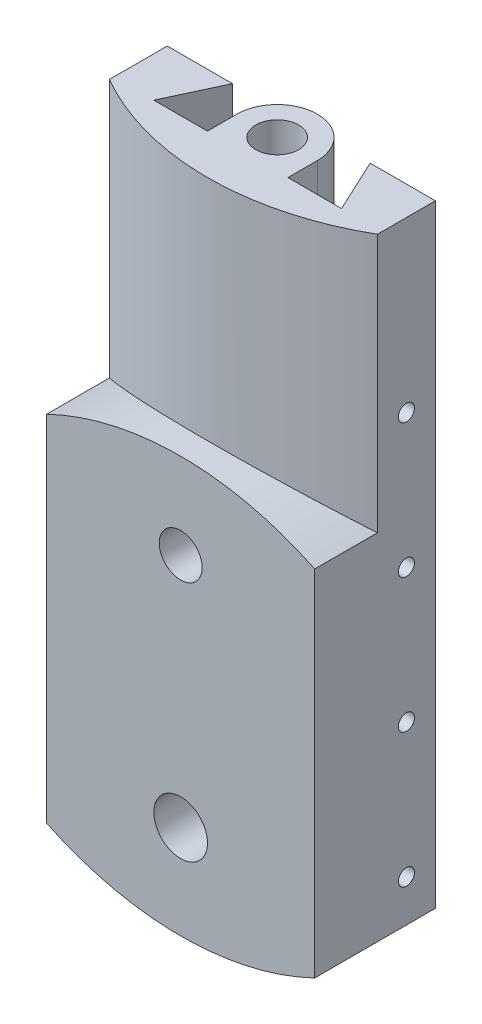
ISO-10303-21;
HEADER;
FILE_DESCRIPTION(('STEP AP214'),'2;1');
FILE_NAME('part.step','',(''),(''),'','','');
FILE_SCHEMA(('AUTOMOTIVE_DESIGN { 1 0 10303 214 1 1 1 1 }'));
ENDSEC;
DATA;
#1=APPLICATION_CONTEXT('core data for automotive mechanical design processes');
#2=APPLICATION_PROTOCOL_DEFINITION('international standard','automotive_design',2000,#1);
#3=PRODUCT_CONTEXT('',#1,'mechanical');
#4=PRODUCT('Part','Part','',(#3));
#5=PRODUCT_RELATED_PRODUCT_CATEGORY('part','',(#4));
#6=PRODUCT_DEFINITION_FORMATION('','',#4);
#7=PRODUCT_DEFINITION_CONTEXT('part definition',#1,'design');
#8=PRODUCT_DEFINITION('design','',#6,#7);
#9=PRODUCT_DEFINITION_SHAPE('','',#8);
#10=(LENGTH_UNIT() NAMED_UNIT(*) SI_UNIT(.MILLI.,.METRE.));
#11=(NAMED_UNIT(*) PLANE_ANGLE_UNIT() SI_UNIT($,.RADIAN.));
#12=(NAMED_UNIT(*) SI_UNIT($,.STERADIAN.) SOLID_ANGLE_UNIT());
#13=UNCERTAINTY_MEASURE_WITH_UNIT(LENGTH_MEASURE(1.E-05),#10,'distance_accuracy_value','');
#14=(GEOMETRIC_REPRESENTATION_CONTEXT(3) GLOBAL_UNCERTAINTY_ASSIGNED_CONTEXT((#13)) GLOBAL_UNIT_ASSIGNED_CONTEXT((#10,
#11,#12)) REPRESENTATION_CONTEXT('',''));
#15=CARTESIAN_POINT('',(0.,0.,0.));
#16=DIRECTION('',(0.,0.,1.));
#17=DIRECTION('',(1.,0.,0.));
#18=AXIS2_PLACEMENT_3D('',#15,#16,#17);
#19=CARTESIAN_POINT('',(0.,-240.,-23.5));
#20=DIRECTION('',(0.,0.,1.));
#21=DIRECTION('',(1.,0.,0.));
#22=AXIS2_PLACEMENT_3D('',#19,#20,#21);
#23=PLANE('',#22);
#24=CARTESIAN_POINT('',(0.,-117.,-23.5));
#25=DIRECTION('',(0.,0.,1.));
#26=DIRECTION('',(1.,0.,0.));
#27=AXIS2_PLACEMENT_3D('',#24,#25,#26);
#28=CIRCLE('',#27,8.);
#29=CARTESIAN_POINT('',(8.,-117.,-23.5));
#30=VERTEX_POINT('',#29);
#31=EDGE_CURVE('E416',#30,#30,#28,.T.);
#32=ORIENTED_EDGE('',*,*,#31,.T.);
#33=EDGE_LOOP('',(#32));
#34=FACE_BOUND('',#33,.T.);
#35=CARTESIAN_POINT('',(0.,-205.,-23.5));
#36=DIRECTION('',(0.,0.,1.));
#37=DIRECTION('',(1.,0.,0.));
#38=AXIS2_PLACEMENT_3D('',#35,#36,#37);
#39=CIRCLE('',#38,10.);
#40=CARTESIAN_POINT('',(10.,-205.,-23.5));
#41=VERTEX_POINT('',#40);
#42=EDGE_CURVE('E204',#41,#41,#39,.T.);
#43=ORIENTED_EDGE('',*,*,#42,.T.);
#44=EDGE_LOOP('',(#43));
#45=FACE_BOUND('',#44,.T.);
#46=CARTESIAN_POINT('',(0.,-125.,-23.5));
#47=DIRECTION('',(0.,0.,1.));
#48=DIRECTION('',(1.,0.,0.));
#49=AXIS2_PLACEMENT_3D('',#46,#47,#48);
#50=CIRCLE('',#49,115.);
#51=CARTESIAN_POINT('',(-15.,-239.017542509914,-23.5));
#52=VERTEX_POINT('',#51);
#53=CARTESIAN_POINT('',(15.,-239.017542509914,-23.5));
#54=VERTEX_POINT('',#53);
#55=EDGE_CURVE('E292',#52,#54,#50,.T.);
#56=ORIENTED_EDGE('',*,*,#55,.F.);
#57=DIRECTION('',(0.,1.,0.));
#58=VECTOR('',#57,1.);
#59=CARTESIAN_POINT('',(-15.,-240.,-23.5));
#60=LINE('',#59,#58);
#61=CARTESIAN_POINT('',(-15.,-25.,-23.5));
#62=VERTEX_POINT('',#61);
#63=EDGE_CURVE('E133',#52,#62,#60,.T.);
#64=ORIENTED_EDGE('',*,*,#63,.T.);
#65=DIRECTION('',(1.,0.,0.));
#66=VECTOR('',#65,1.);
#67=CARTESIAN_POINT('',(0.,-25.,-23.5));
#68=LINE('',#67,#66);
#69=CARTESIAN_POINT('',(15.,-25.,-23.5));
#70=VERTEX_POINT('',#69);
#71=EDGE_CURVE('E118',#62,#70,#68,.T.);
#72=ORIENTED_EDGE('',*,*,#71,.T.);
#73=DIRECTION('',(0.,1.,0.));
#74=VECTOR('',#73,1.);
#75=CARTESIAN_POINT('',(15.,-240.,-23.5));
#76=LINE('',#75,#74);
#77=EDGE_CURVE('E132',#54,#70,#76,.T.);
#78=ORIENTED_EDGE('',*,*,#77,.F.);
#79=EDGE_LOOP('',(#56,#64,#72,#78));
#80=FACE_BOUND('',#79,.T.);
#81=ADVANCED_FACE('F53',(#34,#45,#80),#23,.F.);
#82=CARTESIAN_POINT('',(-15.,-240.,0.));
#83=DIRECTION('',(-1.,0.,0.));
#84=DIRECTION('',(0.,0.,1.));
#85=AXIS2_PLACEMENT_3D('',#82,#83,#84);
#86=PLANE('',#85);
#87=DIRECTION('',(0.,0.,1.));
#88=VECTOR('',#87,1.);
#89=CARTESIAN_POINT('',(-15.,-239.017542509914,-51.));
#90=LINE('',#89,#88);
#91=CARTESIAN_POINT('',(-15.,-239.017542509914,-25.));
#92=VERTEX_POINT('',#91);
#93=EDGE_CURVE('E295',#92,#52,#90,.T.);
#94=ORIENTED_EDGE('',*,*,#93,.F.);
#95=DIRECTION('',(0.,1.,0.));
#96=VECTOR('',#95,1.);
#97=CARTESIAN_POINT('',(-15.,-240.,-25.));
#98=LINE('',#97,#96);
#99=CARTESIAN_POINT('',(-15.,-25.,-25.));
#100=VERTEX_POINT('',#99);
#101=EDGE_CURVE('E137',#92,#100,#98,.T.);
#102=ORIENTED_EDGE('',*,*,#101,.T.);
#103=DIRECTION('',(0.,0.,1.));
#104=VECTOR('',#103,1.);
#105=CARTESIAN_POINT('',(-15.,-25.,0.));
#106=LINE('',#105,#104);
#107=EDGE_CURVE('E117',#100,#62,#106,.T.);
#108=ORIENTED_EDGE('',*,*,#107,.T.);
#109=ORIENTED_EDGE('',*,*,#63,.F.);
#110=EDGE_LOOP('',(#94,#102,#108,#109));
#111=FACE_BOUND('',#110,.T.);
#112=ADVANCED_FACE('F228',(#111),#86,.F.);
#113=CARTESIAN_POINT('',(-50.,-240.,0.));
#114=DIRECTION('',(-1.,0.,0.));
#115=DIRECTION('',(0.,0.,1.));
#116=AXIS2_PLACEMENT_3D('',#113,#114,#115);
#117=PLANE('',#116);
#118=CARTESIAN_POINT('',(-50.,-63.,-34.1987298107781));
#119=DIRECTION('',(1.,0.,0.));
#120=DIRECTION('',(0.,0.,-1.));
#121=AXIS2_PLACEMENT_3D('',#118,#119,#120);
#122=CIRCLE('',#121,3.);
#123=CARTESIAN_POINT('',(-50.,-63.,-37.1987298107781));
#124=VERTEX_POINT('',#123);
#125=EDGE_CURVE('E472',#124,#124,#122,.T.);
#126=ORIENTED_EDGE('',*,*,#125,.T.);
#127=EDGE_LOOP('',(#126));
#128=FACE_BOUND('',#127,.T.);
#129=CARTESIAN_POINT('',(-50.,-113.,-34.1987298107781));
#130=DIRECTION('',(1.,0.,0.));
#131=DIRECTION('',(0.,0.,-1.));
#132=AXIS2_PLACEMENT_3D('',#129,#130,#131);
#133=CIRCLE('',#132,3.);
#134=CARTESIAN_POINT('',(-50.,-113.,-37.1987298107781));
#135=VERTEX_POINT('',#134);
#136=EDGE_CURVE('E481',#135,#135,#133,.T.);
#137=ORIENTED_EDGE('',*,*,#136,.T.);
#138=EDGE_LOOP('',(#137));
#139=FACE_BOUND('',#138,.T.);
#140=CARTESIAN_POINT('',(-50.,-163.,-34.1987298107781));
#141=DIRECTION('',(1.,0.,0.));
#142=DIRECTION('',(0.,0.,-1.));
#143=AXIS2_PLACEMENT_3D('',#140,#141,#142);
#144=CIRCLE('',#143,3.);
#145=CARTESIAN_POINT('',(-50.,-163.,-37.1987298107781));
#146=VERTEX_POINT('',#145);
#147=EDGE_CURVE('E489',#146,#146,#144,.T.);
#148=ORIENTED_EDGE('',*,*,#147,.T.);
#149=EDGE_LOOP('',(#148));
#150=FACE_BOUND('',#149,.T.);
#151=CARTESIAN_POINT('',(-50.,-213.,-34.1987298107781));
#152=DIRECTION('',(1.,0.,0.));
#153=DIRECTION('',(0.,0.,-1.));
#154=AXIS2_PLACEMENT_3D('',#151,#152,#153);
#155=CIRCLE('',#154,3.);
#156=CARTESIAN_POINT('',(-50.,-213.,-37.1987298107781));
#157=VERTEX_POINT('',#156);
#158=EDGE_CURVE('E495',#157,#157,#155,.T.);
#159=ORIENTED_EDGE('',*,*,#158,.T.);
#160=EDGE_LOOP('',(#159));
#161=FACE_BOUND('',#160,.T.);
#162=DIRECTION('',(0.,1.,0.));
#163=VECTOR('',#162,1.);
#164=CARTESIAN_POINT('',(-50.,-240.,-45.));
#165=LINE('',#164,#163);
#166=CARTESIAN_POINT('',(-50.,-228.56157588604,-45.));
#167=VERTEX_POINT('',#166);
#168=CARTESIAN_POINT('',(-50.,0.,-45.));
#169=VERTEX_POINT('',#168);
#170=EDGE_CURVE('E146',#167,#169,#165,.T.);
#171=ORIENTED_EDGE('',*,*,#170,.F.);
#172=DIRECTION('',(0.,0.,1.));
#173=VECTOR('',#172,1.);
#174=CARTESIAN_POINT('',(-50.,-228.56157588604,-51.002));
#175=LINE('',#174,#173);
#176=CARTESIAN_POINT('',(-50.,-228.56157588604,0.));
#177=VERTEX_POINT('',#176);
#178=EDGE_CURVE('E205',#167,#177,#175,.T.);
#179=ORIENTED_EDGE('',*,*,#178,.T.);
#180=DIRECTION('',(0.,-1.,0.));
#181=VECTOR('',#180,1.);
#182=CARTESIAN_POINT('',(-50.,-96.4384241139601,0.));
#183=LINE('',#182,#181);
#184=CARTESIAN_POINT('',(-50.,-96.4384241139601,0.));
#185=VERTEX_POINT('',#184);
#186=EDGE_CURVE('E378',#185,#177,#183,.T.);
#187=ORIENTED_EDGE('',*,*,#186,.F.);
#188=DIRECTION('',(0.,0.,1.));
#189=VECTOR('',#188,1.);
#190=CARTESIAN_POINT('',(-50.,-96.4384241139601,-51.002));
#191=LINE('',#190,#189);
#192=CARTESIAN_POINT('',(-50.,-96.4384241139601,-23.3974596215561));
#193=VERTEX_POINT('',#192);
#194=EDGE_CURVE('E68',#193,#185,#191,.T.);
#195=ORIENTED_EDGE('',*,*,#194,.F.);
#196=DIRECTION('',(0.,1.,0.));
#197=VECTOR('',#196,1.);
#198=CARTESIAN_POINT('',(-50.,-240.,-23.3974596215561));
#199=LINE('',#198,#197);
#200=CARTESIAN_POINT('',(-50.,0.,-23.3974596215561));
#201=VERTEX_POINT('',#200);
#202=EDGE_CURVE('E149',#193,#201,#199,.T.);
#203=ORIENTED_EDGE('',*,*,#202,.T.);
#204=DIRECTION('',(0.,0.,1.));
#205=VECTOR('',#204,1.);
#206=CARTESIAN_POINT('',(-50.,0.,0.));
#207=LINE('',#206,#205);
#208=EDGE_CURVE('E182',#169,#201,#207,.T.);
#209=ORIENTED_EDGE('',*,*,#208,.F.);
#210=EDGE_LOOP('',(#171,#179,#187,#195,#203,#209));
#211=FACE_BOUND('',#210,.T.);
#212=ADVANCED_FACE('F234',(#128,#139,#150,#161,#211),#117,.T.);
#213=CARTESIAN_POINT('',(0.,-240.,-45.));
#214=DIRECTION('',(0.,0.,-1.));
#215=DIRECTION('',(-1.,0.,0.));
#216=AXIS2_PLACEMENT_3D('',#213,#214,#215);
#217=PLANE('',#216);
#218=DIRECTION('',(0.,1.,0.));
#219=VECTOR('',#218,1.);
#220=CARTESIAN_POINT('',(-25.6738468368999,-240.,-45.));
#221=LINE('',#220,#219);
#222=CARTESIAN_POINT('',(-25.6738468368999,-237.097518208903,-45.));
#223=VERTEX_POINT('',#222);
#224=CARTESIAN_POINT('',(-25.6738468368999,0.,-45.));
#225=VERTEX_POINT('',#224);
#226=EDGE_CURVE('E143',#223,#225,#221,.T.);
#227=ORIENTED_EDGE('',*,*,#226,.F.);
#228=CARTESIAN_POINT('',(0.,-125.,-45.));
#229=DIRECTION('',(0.,0.,-1.));
#230=DIRECTION('',(-1.,0.,0.));
#231=AXIS2_PLACEMENT_3D('',#228,#229,#230);
#232=CIRCLE('',#231,115.);
#233=EDGE_CURVE('E301',#223,#167,#232,.T.);
#234=ORIENTED_EDGE('',*,*,#233,.T.);
#235=ORIENTED_EDGE('',*,*,#170,.T.);
#236=DIRECTION('',(-1.,0.,0.));
#237=VECTOR('',#236,1.);
#238=CARTESIAN_POINT('',(0.,0.,-45.));
#239=LINE('',#238,#237);
#240=EDGE_CURVE('E185',#225,#169,#239,.T.);
#241=ORIENTED_EDGE('',*,*,#240,.F.);
#242=EDGE_LOOP('',(#227,#234,#235,#241));
#243=FACE_BOUND('',#242,.T.);
#244=ADVANCED_FACE('F401',(#243),#217,.T.);
#245=CARTESIAN_POINT('',(-38.3243387085016,-240.,-17.8709326335006));
#246=DIRECTION('',(0.906307787036648,0.,0.422618261740704));
#247=DIRECTION('',(0.422618261740704,0.,-0.906307787036648));
#248=AXIS2_PLACEMENT_3D('',#245,#246,#247);
#249=PLANE('',#248);
#250=CARTESIAN_POINT('',(-30.7105618439354,-63.,-34.1987298107781));
#251=DIRECTION('',(0.906307787036648,0.,0.422618261740704));
#252=DIRECTION('',(0.422618261740704,0.,-0.906307787036648));
#253=AXIS2_PLACEMENT_3D('',#250,#251,#252);
#254=ELLIPSE('',#253,3.31013375688749,3.);
#255=CARTESIAN_POINT('',(-29.3116388694704,-63.,-37.1987298107781));
#256=VERTEX_POINT('',#255);
#257=EDGE_CURVE('E469',#256,#256,#254,.T.);
#258=ORIENTED_EDGE('',*,*,#257,.F.);
#259=EDGE_LOOP('',(#258));
#260=FACE_BOUND('',#259,.T.);
#261=CARTESIAN_POINT('',(-30.7105618439354,-113.,-34.1987298107781));
#262=DIRECTION('',(0.906307787036648,0.,0.422618261740704));
#263=DIRECTION('',(0.422618261740704,0.,-0.906307787036648));
#264=AXIS2_PLACEMENT_3D('',#261,#262,#263);
#265=ELLIPSE('',#264,3.31013375688749,3.);
#266=CARTESIAN_POINT('',(-29.3116388694704,-113.,-37.1987298107781));
#267=VERTEX_POINT('',#266);
#268=EDGE_CURVE('E512',#267,#267,#265,.T.);
#269=ORIENTED_EDGE('',*,*,#268,.F.);
#270=EDGE_LOOP('',(#269));
#271=FACE_BOUND('',#270,.T.);
#272=CARTESIAN_POINT('',(-30.7105618439354,-163.,-34.1987298107781));
#273=DIRECTION('',(0.906307787036648,0.,0.422618261740704));
#274=DIRECTION('',(0.422618261740704,0.,-0.906307787036648));
#275=AXIS2_PLACEMENT_3D('',#272,#273,#274);
#276=ELLIPSE('',#275,3.31013375688749,3.);
#277=CARTESIAN_POINT('',(-29.3116388694704,-163.,-37.1987298107781));
#278=VERTEX_POINT('',#277);
#279=EDGE_CURVE('E506',#278,#278,#276,.T.);
#280=ORIENTED_EDGE('',*,*,#279,.F.);
#281=EDGE_LOOP('',(#280));
#282=FACE_BOUND('',#281,.T.);
#283=CARTESIAN_POINT('',(-30.7105618439354,-213.,-34.1987298107781));
#284=DIRECTION('',(0.906307787036648,0.,0.422618261740704));
#285=DIRECTION('',(0.422618261740704,0.,-0.906307787036648));
#286=AXIS2_PLACEMENT_3D('',#283,#284,#285);
#287=ELLIPSE('',#286,3.31013375688749,3.);
#288=CARTESIAN_POINT('',(-29.3116388694704,-213.,-37.1987298107781));
#289=VERTEX_POINT('',#288);
#290=EDGE_CURVE('E478',#289,#289,#287,.T.);
#291=ORIENTED_EDGE('',*,*,#290,.F.);
#292=EDGE_LOOP('',(#291));
#293=FACE_BOUND('',#292,.T.);
#294=DIRECTION('',(0.,1.,0.));
#295=VECTOR('',#294,1.);
#296=CARTESIAN_POINT('',(-35.,-240.,-25.));
#297=LINE('',#296,#295);
#298=CARTESIAN_POINT('',(-35.,-234.544511501033,-25.));
#299=VERTEX_POINT('',#298);
#300=CARTESIAN_POINT('',(-35.,0.,-25.));
#301=VERTEX_POINT('',#300);
#302=EDGE_CURVE('E140',#299,#301,#297,.T.);
#303=ORIENTED_EDGE('',*,*,#302,.F.);
#304=CARTESIAN_POINT('',(0.,-125.,-100.057742217834));
#305=DIRECTION('',(0.906307787036648,0.,0.422618261740704));
#306=DIRECTION('',(-0.422618261740704,0.,0.906307787036648));
#307=AXIS2_PLACEMENT_3D('',#304,#305,#306);
#308=ELLIPSE('',#307,272.113182062535,115.);
#309=EDGE_CURVE('E408',#299,#223,#308,.T.);
#310=ORIENTED_EDGE('',*,*,#309,.T.);
#311=ORIENTED_EDGE('',*,*,#226,.T.);
#312=DIRECTION('',(0.422618261740704,0.,-0.906307787036648));
#313=VECTOR('',#312,1.);
#314=CARTESIAN_POINT('',(-38.3243387085016,0.,-17.8709326335006));
#315=LINE('',#314,#313);
#316=EDGE_CURVE('E188',#301,#225,#315,.T.);
#317=ORIENTED_EDGE('',*,*,#316,.F.);
#318=EDGE_LOOP('',(#303,#310,#311,#317));
#319=FACE_BOUND('',#318,.T.);
#320=ADVANCED_FACE('F544',(#260,#271,#282,#293,#319),#249,.T.);
#321=CARTESIAN_POINT('',(0.,-240.,-25.));
#322=DIRECTION('',(0.,0.,-1.));
#323=DIRECTION('',(-1.,0.,0.));
#324=AXIS2_PLACEMENT_3D('',#321,#322,#323);
#325=PLANE('',#324);
#326=ORIENTED_EDGE('',*,*,#101,.F.);
#327=CARTESIAN_POINT('',(0.,-125.,-25.));
#328=DIRECTION('',(0.,0.,-1.));
#329=DIRECTION('',(-1.,0.,0.));
#330=AXIS2_PLACEMENT_3D('',#327,#328,#329);
#331=CIRCLE('',#330,115.);
#332=EDGE_CURVE('E306',#92,#299,#331,.T.);
#333=ORIENTED_EDGE('',*,*,#332,.T.);
#334=ORIENTED_EDGE('',*,*,#302,.T.);
#335=DIRECTION('',(-1.,0.,0.));
#336=VECTOR('',#335,1.);
#337=CARTESIAN_POINT('',(0.,0.,-25.));
#338=LINE('',#337,#336);
#339=CARTESIAN_POINT('',(-15.,0.,-25.));
#340=VERTEX_POINT('',#339);
#341=EDGE_CURVE('E191',#340,#301,#338,.T.);
#342=ORIENTED_EDGE('',*,*,#341,.F.);
#343=EDGE_CURVE('E100',#100,#340,#98,.T.);
#344=ORIENTED_EDGE('',*,*,#343,.F.);
#345=EDGE_LOOP('',(#326,#333,#334,#342,#344));
#346=FACE_BOUND('',#345,.T.);
#347=ADVANCED_FACE('F305',(#346),#325,.T.);
#348=CARTESIAN_POINT('',(15.,-240.,0.));
#349=DIRECTION('',(1.,0.,0.));
#350=DIRECTION('',(0.,0.,-1.));
#351=AXIS2_PLACEMENT_3D('',#348,#349,#350);
#352=PLANE('',#351);
#353=DIRECTION('',(0.,0.,1.));
#354=VECTOR('',#353,1.);
#355=CARTESIAN_POINT('',(15.,-239.017542509914,-51.));
#356=LINE('',#355,#354);
#357=CARTESIAN_POINT('',(15.,-239.017542509914,-25.));
#358=VERTEX_POINT('',#357);
#359=EDGE_CURVE('E286',#54,#358,#356,.F.);
#360=ORIENTED_EDGE('',*,*,#359,.F.);
#361=ORIENTED_EDGE('',*,*,#77,.T.);
#362=DIRECTION('',(0.,0.,-1.));
#363=VECTOR('',#362,1.);
#364=CARTESIAN_POINT('',(15.,-25.,0.));
#365=LINE('',#364,#363);
#366=CARTESIAN_POINT('',(15.,-25.,-25.));
#367=VERTEX_POINT('',#366);
#368=EDGE_CURVE('E124',#70,#367,#365,.T.);
#369=ORIENTED_EDGE('',*,*,#368,.T.);
#370=DIRECTION('',(0.,1.,0.));
#371=VECTOR('',#370,1.);
#372=CARTESIAN_POINT('',(15.,-240.,-25.));
#373=LINE('',#372,#371);
#374=EDGE_CURVE('E164',#358,#367,#373,.T.);
#375=ORIENTED_EDGE('',*,*,#374,.F.);
#376=EDGE_LOOP('',(#360,#361,#369,#375));
#377=FACE_BOUND('',#376,.T.);
#378=ADVANCED_FACE('F282',(#377),#352,.F.);
#379=CARTESIAN_POINT('',(0.,-240.,-25.));
#380=DIRECTION('',(0.,0.,-1.));
#381=DIRECTION('',(-1.,0.,0.));
#382=AXIS2_PLACEMENT_3D('',#379,#380,#381);
#383=PLANE('',#382);
#384=DIRECTION('',(0.,1.,0.));
#385=VECTOR('',#384,1.);
#386=CARTESIAN_POINT('',(35.,-240.,-25.));
#387=LINE('',#386,#385);
#388=CARTESIAN_POINT('',(35.,-234.544511501033,-25.));
#389=VERTEX_POINT('',#388);
#390=CARTESIAN_POINT('',(35.,0.,-25.));
#391=VERTEX_POINT('',#390);
#392=EDGE_CURVE('E160',#389,#391,#387,.T.);
#393=ORIENTED_EDGE('',*,*,#392,.F.);
#394=CARTESIAN_POINT('',(0.,-125.,-25.));
#395=DIRECTION('',(0.,0.,-1.));
#396=DIRECTION('',(-1.,0.,0.));
#397=AXIS2_PLACEMENT_3D('',#394,#395,#396);
#398=CIRCLE('',#397,115.);
#399=EDGE_CURVE('E422',#389,#358,#398,.T.);
#400=ORIENTED_EDGE('',*,*,#399,.T.);
#401=ORIENTED_EDGE('',*,*,#374,.T.);
#402=CARTESIAN_POINT('',(15.,0.,-25.));
#403=VERTEX_POINT('',#402);
#404=EDGE_CURVE('E163',#367,#403,#373,.T.);
#405=ORIENTED_EDGE('',*,*,#404,.T.);
#406=DIRECTION('',(-1.,0.,0.));
#407=VECTOR('',#406,1.);
#408=CARTESIAN_POINT('',(0.,0.,-25.));
#409=LINE('',#408,#407);
#410=EDGE_CURVE('E136',#391,#403,#409,.T.);
#411=ORIENTED_EDGE('',*,*,#410,.F.);
#412=EDGE_LOOP('',(#393,#400,#401,#405,#411));
#413=FACE_BOUND('',#412,.T.);
#414=ADVANCED_FACE('F339',(#413),#383,.T.);
#415=CARTESIAN_POINT('',(38.3243387085016,-240.,-17.8709326335006));
#416=DIRECTION('',(-0.906307787036648,0.,0.422618261740704));
#417=DIRECTION('',(0.422618261740704,0.,0.906307787036648));
#418=AXIS2_PLACEMENT_3D('',#415,#416,#417);
#419=PLANE('',#418);
#420=CARTESIAN_POINT('',(30.7105618439354,-63.,-34.1987298107781));
#421=DIRECTION('',(-0.906307787036648,0.,0.422618261740704));
#422=DIRECTION('',(0.422618261740704,0.,0.906307787036648));
#423=AXIS2_PLACEMENT_3D('',#420,#421,#422);
#424=ELLIPSE('',#423,3.31013375688748,3.);
#425=CARTESIAN_POINT('',(32.1094848184004,-63.,-31.1987298107781));
#426=VERTEX_POINT('',#425);
#427=EDGE_CURVE('E515',#426,#426,#424,.T.);
#428=ORIENTED_EDGE('',*,*,#427,.F.);
#429=EDGE_LOOP('',(#428));
#430=FACE_BOUND('',#429,.T.);
#431=CARTESIAN_POINT('',(30.7105618439354,-113.,-34.1987298107781));
#432=DIRECTION('',(-0.906307787036648,0.,0.422618261740704));
#433=DIRECTION('',(0.422618261740704,0.,0.906307787036648));
#434=AXIS2_PLACEMENT_3D('',#431,#432,#433);
#435=ELLIPSE('',#434,3.31013375688748,3.);
#436=CARTESIAN_POINT('',(32.1094848184004,-113.,-31.1987298107781));
#437=VERTEX_POINT('',#436);
#438=EDGE_CURVE('E509',#437,#437,#435,.T.);
#439=ORIENTED_EDGE('',*,*,#438,.F.);
#440=EDGE_LOOP('',(#439));
#441=FACE_BOUND('',#440,.T.);
#442=CARTESIAN_POINT('',(30.7105618439354,-163.,-34.1987298107781));
#443=DIRECTION('',(-0.906307787036648,0.,0.422618261740704));
#444=DIRECTION('',(0.422618261740704,0.,0.906307787036648));
#445=AXIS2_PLACEMENT_3D('',#442,#443,#444);
#446=ELLIPSE('',#445,3.31013375688748,3.);
#447=CARTESIAN_POINT('',(32.1094848184004,-163.,-31.1987298107781));
#448=VERTEX_POINT('',#447);
#449=EDGE_CURVE('E503',#448,#448,#446,.T.);
#450=ORIENTED_EDGE('',*,*,#449,.F.);
#451=EDGE_LOOP('',(#450));
#452=FACE_BOUND('',#451,.T.);
#453=CARTESIAN_POINT('',(30.7105618439354,-213.,-34.1987298107781));
#454=DIRECTION('',(-0.906307787036648,0.,0.422618261740704));
#455=DIRECTION('',(0.422618261740704,0.,0.906307787036648));
#456=AXIS2_PLACEMENT_3D('',#453,#454,#455);
#457=ELLIPSE('',#456,3.31013375688748,3.);
#458=CARTESIAN_POINT('',(32.1094848184004,-213.,-31.1987298107781));
#459=VERTEX_POINT('',#458);
#460=EDGE_CURVE('E474',#459,#459,#457,.T.);
#461=ORIENTED_EDGE('',*,*,#460,.F.);
#462=EDGE_LOOP('',(#461));
#463=FACE_BOUND('',#462,.T.);
#464=DIRECTION('',(0.,1.,0.));
#465=VECTOR('',#464,1.);
#466=CARTESIAN_POINT('',(25.6738468368999,-240.,-45.));
#467=LINE('',#466,#465);
#468=CARTESIAN_POINT('',(25.6738468368999,-237.097518208903,-45.));
#469=VERTEX_POINT('',#468);
#470=CARTESIAN_POINT('',(25.6738468368999,0.,-45.));
#471=VERTEX_POINT('',#470);
#472=EDGE_CURVE('E157',#469,#471,#467,.T.);
#473=ORIENTED_EDGE('',*,*,#472,.F.);
#474=CARTESIAN_POINT('',(0.,-125.,-100.057742217834));
#475=DIRECTION('',(-0.906307787036648,0.,0.422618261740704));
#476=DIRECTION('',(0.422618261740704,0.,0.906307787036648));
#477=AXIS2_PLACEMENT_3D('',#474,#475,#476);
#478=ELLIPSE('',#477,272.113182062535,115.);
#479=EDGE_CURVE('E337',#469,#389,#478,.T.);
#480=ORIENTED_EDGE('',*,*,#479,.T.);
#481=ORIENTED_EDGE('',*,*,#392,.T.);
#482=DIRECTION('',(0.422618261740704,0.,0.906307787036648));
#483=VECTOR('',#482,1.);
#484=CARTESIAN_POINT('',(38.3243387085016,0.,-17.8709326335006));
#485=LINE('',#484,#483);
#486=EDGE_CURVE('E170',#471,#391,#485,.T.);
#487=ORIENTED_EDGE('',*,*,#486,.F.);
#488=EDGE_LOOP('',(#473,#480,#481,#487));
#489=FACE_BOUND('',#488,.T.);
#490=ADVANCED_FACE('F334',(#430,#441,#452,#463,#489),#419,.T.);
#491=CARTESIAN_POINT('',(0.,-240.,-45.));
#492=DIRECTION('',(0.,0.,-1.));
#493=DIRECTION('',(-1.,0.,0.));
#494=AXIS2_PLACEMENT_3D('',#491,#492,#493);
#495=PLANE('',#494);
#496=DIRECTION('',(0.,1.,0.));
#497=VECTOR('',#496,1.);
#498=CARTESIAN_POINT('',(50.,-240.,-45.));
#499=LINE('',#498,#497);
#500=CARTESIAN_POINT('',(50.,-228.56157588604,-45.));
#501=VERTEX_POINT('',#500);
#502=CARTESIAN_POINT('',(50.,0.,-45.));
#503=VERTEX_POINT('',#502);
#504=EDGE_CURVE('E154',#501,#503,#499,.T.);
#505=ORIENTED_EDGE('',*,*,#504,.F.);
#506=CARTESIAN_POINT('',(0.,-125.,-45.));
#507=DIRECTION('',(0.,0.,-1.));
#508=DIRECTION('',(-1.,0.,0.));
#509=AXIS2_PLACEMENT_3D('',#506,#507,#508);
#510=CIRCLE('',#509,115.);
#511=EDGE_CURVE('E349',#501,#469,#510,.T.);
#512=ORIENTED_EDGE('',*,*,#511,.T.);
#513=ORIENTED_EDGE('',*,*,#472,.T.);
#514=DIRECTION('',(-1.,0.,0.));
#515=VECTOR('',#514,1.);
#516=CARTESIAN_POINT('',(0.,0.,-45.));
#517=LINE('',#516,#515);
#518=EDGE_CURVE('E173',#503,#471,#517,.T.);
#519=ORIENTED_EDGE('',*,*,#518,.F.);
#520=EDGE_LOOP('',(#505,#512,#513,#519));
#521=FACE_BOUND('',#520,.T.);
#522=ADVANCED_FACE('F344',(#521),#495,.T.);
#523=CARTESIAN_POINT('',(50.,-240.,0.));
#524=DIRECTION('',(1.,0.,0.));
#525=DIRECTION('',(0.,0.,-1.));
#526=AXIS2_PLACEMENT_3D('',#523,#524,#525);
#527=PLANE('',#526);
#528=CARTESIAN_POINT('',(50.,-63.,-34.1987298107781));
#529=DIRECTION('',(1.,0.,0.));
#530=DIRECTION('',(0.,0.,-1.));
#531=AXIS2_PLACEMENT_3D('',#528,#529,#530);
#532=CIRCLE('',#531,3.);
#533=CARTESIAN_POINT('',(50.,-63.,-37.1987298107781));
#534=VERTEX_POINT('',#533);
#535=EDGE_CURVE('E475',#534,#534,#532,.T.);
#536=ORIENTED_EDGE('',*,*,#535,.F.);
#537=EDGE_LOOP('',(#536));
#538=FACE_BOUND('',#537,.T.);
#539=CARTESIAN_POINT('',(50.,-113.,-34.1987298107781));
#540=DIRECTION('',(1.,0.,0.));
#541=DIRECTION('',(0.,0.,-1.));
#542=AXIS2_PLACEMENT_3D('',#539,#540,#541);
#543=CIRCLE('',#542,3.);
#544=CARTESIAN_POINT('',(50.,-113.,-37.1987298107781));
#545=VERTEX_POINT('',#544);
#546=EDGE_CURVE('E486',#545,#545,#543,.T.);
#547=ORIENTED_EDGE('',*,*,#546,.F.);
#548=EDGE_LOOP('',(#547));
#549=FACE_BOUND('',#548,.T.);
#550=CARTESIAN_POINT('',(50.,-163.,-34.1987298107781));
#551=DIRECTION('',(1.,0.,0.));
#552=DIRECTION('',(0.,0.,-1.));
#553=AXIS2_PLACEMENT_3D('',#550,#551,#552);
#554=CIRCLE('',#553,3.);
#555=CARTESIAN_POINT('',(50.,-163.,-37.1987298107781));
#556=VERTEX_POINT('',#555);
#557=EDGE_CURVE('E492',#556,#556,#554,.T.);
#558=ORIENTED_EDGE('',*,*,#557,.F.);
#559=EDGE_LOOP('',(#558));
#560=FACE_BOUND('',#559,.T.);
#561=CARTESIAN_POINT('',(50.,-213.,-34.1987298107781));
#562=DIRECTION('',(1.,0.,0.));
#563=DIRECTION('',(0.,0.,-1.));
#564=AXIS2_PLACEMENT_3D('',#561,#562,#563);
#565=CIRCLE('',#564,3.);
#566=CARTESIAN_POINT('',(50.,-213.,-37.1987298107781));
#567=VERTEX_POINT('',#566);
#568=EDGE_CURVE('E498',#567,#567,#565,.T.);
#569=ORIENTED_EDGE('',*,*,#568,.F.);
#570=EDGE_LOOP('',(#569));
#571=FACE_BOUND('',#570,.T.);
#572=DIRECTION('',(0.,0.,1.));
#573=VECTOR('',#572,1.);
#574=CARTESIAN_POINT('',(50.,-228.56157588604,-51.002));
#575=LINE('',#574,#573);
#576=CARTESIAN_POINT('',(50.,-228.56157588604,0.));
#577=VERTEX_POINT('',#576);
#578=EDGE_CURVE('E203',#501,#577,#575,.T.);
#579=ORIENTED_EDGE('',*,*,#578,.F.);
#580=ORIENTED_EDGE('',*,*,#504,.T.);
#581=DIRECTION('',(0.,0.,-1.));
#582=VECTOR('',#581,1.);
#583=CARTESIAN_POINT('',(50.,0.,0.));
#584=LINE('',#583,#582);
#585=CARTESIAN_POINT('',(50.,0.,-23.3974596215562));
#586=VERTEX_POINT('',#585);
#587=EDGE_CURVE('E176',#586,#503,#584,.T.);
#588=ORIENTED_EDGE('',*,*,#587,.F.);
#589=DIRECTION('',(0.,1.,0.));
#590=VECTOR('',#589,1.);
#591=CARTESIAN_POINT('',(50.,-240.,-23.3974596215562));
#592=LINE('',#591,#590);
#593=CARTESIAN_POINT('',(50.,-96.4384241139601,-23.3974596215562));
#594=VERTEX_POINT('',#593);
#595=EDGE_CURVE('E151',#594,#586,#592,.T.);
#596=ORIENTED_EDGE('',*,*,#595,.F.);
#597=DIRECTION('',(0.,0.,1.));
#598=VECTOR('',#597,1.);
#599=CARTESIAN_POINT('',(50.,-96.4384241139601,-51.002));
#600=LINE('',#599,#598);
#601=CARTESIAN_POINT('',(50.,-96.4384241139601,0.));
#602=VERTEX_POINT('',#601);
#603=EDGE_CURVE('E376',#594,#602,#600,.T.);
#604=ORIENTED_EDGE('',*,*,#603,.T.);
#605=DIRECTION('',(0.,1.,0.));
#606=VECTOR('',#605,1.);
#607=CARTESIAN_POINT('',(50.,-96.4384241139601,0.));
#608=LINE('',#607,#606);
#609=EDGE_CURVE('E385',#577,#602,#608,.T.);
#610=ORIENTED_EDGE('',*,*,#609,.F.);
#611=EDGE_LOOP('',(#579,#580,#588,#596,#604,#610));
#612=FACE_BOUND('',#611,.T.);
#613=ADVANCED_FACE('F257',(#538,#549,#560,#571,#612),#527,.T.);
#614=CARTESIAN_POINT('',(0.,-240.,-110.));
#615=DIRECTION('',(0.,1.,0.));
#616=DIRECTION('',(0.,0.,1.));
#617=AXIS2_PLACEMENT_3D('',#614,#615,#616);
#618=CYLINDRICAL_SURFACE('',#617,100.);
#619=CARTESIAN_POINT('',(-50.,-96.4384241139601,-23.3974596215561));
#620=CARTESIAN_POINT('',(-49.0613724271612,-95.9852417213778,-22.8555383600111));
#621=CARTESIAN_POINT('',(-48.1103493634767,-95.5418276330279,-22.3268159168538));
#622=CARTESIAN_POINT('',(-46.1839975106068,-94.6759611394564,-21.2969494380926));
#623=CARTESIAN_POINT('',(-45.2086662117365,-94.253510912213,-20.7958082673757));
#624=CARTESIAN_POINT('',(-43.2335359888396,-93.4307410357385,-19.8219828299175));
#625=CARTESIAN_POINT('',(-42.2337169038287,-93.0304405710285,-19.3493232012416));
#626=CARTESIAN_POINT('',(-40.2112058416324,-92.2538527061087,-18.4342266261751));
#627=CARTESIAN_POINT('',(-39.1885144981671,-91.8775646416994,-17.9917888438036));
#628=CARTESIAN_POINT('',(-37.1152773475483,-91.1484014547393,-17.1360082972272));
#629=CARTESIAN_POINT('',(-36.0646064217957,-90.7956712867374,-16.7228448561978));
#630=CARTESIAN_POINT('',(-33.9421471334508,-90.1174636193997,-15.9297386773444));
#631=CARTESIAN_POINT('',(-32.8703591317146,-89.7919856548666,-15.5497953724451));
#632=CARTESIAN_POINT('',(-30.707123206072,-89.1697738985944,-14.824510852358));
#633=CARTESIAN_POINT('',(-29.6156787732208,-88.8730350612359,-14.4791635629122));
#634=CARTESIAN_POINT('',(-27.4145558175956,-88.309657840456,-13.8243254032616));
#635=CARTESIAN_POINT('',(-26.30487952392,-88.0430158081959,-13.5148301863485));
#636=CARTESIAN_POINT('',(-24.0625995637298,-87.5397007871593,-12.9312571913061));
#637=CARTESIAN_POINT('',(-22.9299026068814,-87.3032030373578,-12.6573863362203));
#638=CARTESIAN_POINT('',(-20.6495123559672,-86.8631533408474,-12.1482628451768));
#639=CARTESIAN_POINT('',(-19.5018190362822,-86.6596014504299,-11.9130102752024));
#640=CARTESIAN_POINT('',(-17.1934068515134,-86.2865274152922,-11.4821566279029));
#641=CARTESIAN_POINT('',(-16.0326868081164,-86.11700837559,-11.2865591685317));
#642=CARTESIAN_POINT('',(-13.7005728178833,-85.8129732703679,-10.9359565922023));
#643=CARTESIAN_POINT('',(-12.529178902296,-85.6784571024074,-10.7809513564455));
#644=CARTESIAN_POINT('',(-10.182262561548,-85.4456148402107,-10.5127567346701));
#645=CARTESIAN_POINT('',(-9.0067693397266,-85.3471625772133,-10.3994215615939));
#646=CARTESIAN_POINT('',(-6.65004044606496,-85.1863598986581,-10.2143594880198));
#647=CARTESIAN_POINT('',(-5.46880475128999,-85.1240096274067,-10.1426327538386));
#648=CARTESIAN_POINT('',(-3.10327870322691,-85.0357863497536,-10.0411532262272));
#649=CARTESIAN_POINT('',(-1.91898863641139,-85.0099100387502,-10.0113966302321));
#650=CARTESIAN_POINT('',(0.450121501028222,-84.9947803800737,-9.99399736915372));
#651=CARTESIAN_POINT('',(1.63494156133085,-85.0055263477986,-10.0063539168243));
#652=CARTESIAN_POINT('',(3.90373703154657,-85.0611512065716,-10.0703288457631));
#653=CARTESIAN_POINT('',(4.98788151537983,-85.1031085625829,-10.1185867226154));
#654=CARTESIAN_POINT('',(7.15252243576149,-85.2175266875431,-10.250226856259));
#655=CARTESIAN_POINT('',(8.23301854018597,-85.2899901619132,-10.3336122283168));
#656=CARTESIAN_POINT('',(10.3881598228903,-85.4650497705064,-10.535145329954));
#657=CARTESIAN_POINT('',(11.4628057605409,-85.567641894121,-10.6532884327234));
#658=CARTESIAN_POINT('',(13.604614482571,-85.802472827579,-10.9238690254754));
#659=CARTESIAN_POINT('',(14.6717765327656,-85.9347145052816,-11.0763098329156));
#660=CARTESIAN_POINT('',(16.7995935939873,-86.2286052372239,-11.4153286458375));
#661=CARTESIAN_POINT('',(17.8602232120194,-86.3903328310838,-11.6019978309131));
#662=CARTESIAN_POINT('',(19.9704498205163,-86.7422164891679,-12.0084907945552));
#663=CARTESIAN_POINT('',(21.020045738956,-86.9323752889155,-12.2283177634331));
#664=CARTESIAN_POINT('',(23.1063892276094,-87.3402277535788,-12.7002652190929));
#665=CARTESIAN_POINT('',(24.1431386417918,-87.5579174152857,-12.9523810108874));
#666=CARTESIAN_POINT('',(26.2025257055168,-88.0199043546786,-13.4880310542692));
#667=CARTESIAN_POINT('',(27.2251621377223,-88.2642039116791,-13.7715679973232));
#668=CARTESIAN_POINT('',(30.1905260529895,-89.0154164277687,-14.644540435142));
#669=CARTESIAN_POINT('',(32.1126829243768,-89.5568678988834,-15.2750812877048));
#670=CARTESIAN_POINT('',(35.8919013052272,-90.7265498309386,-16.6414890209036));
#671=CARTESIAN_POINT('',(37.7489536591467,-91.3547924362892,-17.3773706420644));
#672=CARTESIAN_POINT('',(41.382427984599,-92.6863583481918,-18.9429501369482));
#673=CARTESIAN_POINT('',(43.1592252936525,-93.3892658636111,-19.7721298449927));
#674=CARTESIAN_POINT('',(45.7676589758324,-94.4954334845628,-21.0828006163042));
#675=CARTESIAN_POINT('',(46.627506790358,-94.8727081356692,-21.5307428327407));
#676=CARTESIAN_POINT('',(48.328113432367,-95.6435688972285,-22.4481499437949));
#677=CARTESIAN_POINT('',(49.1688736078733,-96.0371538502203,-22.9176133114138));
#678=CARTESIAN_POINT('',(50.,-96.4384241139601,-23.3974596215561));
#679=B_SPLINE_CURVE_WITH_KNOTS('',3,(#619,#620,#621,#622,#623,#624,#625,#626,#627,#628,#629,
#630,#631,#632,#633,#634,#635,#636,#637,#638,#639,#640,#641,#642,#643,#644,#645,#646,#647,#648,
#649,#650,#651,#652,#653,#654,#655,#656,#657,#658,#659,#660,#661,#662,#663,#664,#665,#666,#667,
#668,#669,#670,#671,#672,#673,#674,#675,#676,#677,#678),.UNSPECIFIED.,.F.,.F.,(4,2,2,2,2,2,2,2,
2,2,2,2,2,2,2,2,2,2,2,2,2,2,2,2,2,2,2,2,2,4),(0.,3.52418696541696,7.04873930251328,
10.5762980456564,14.1037591717743,17.6512345000388,21.1986492602642,24.7454400810518,
28.2918004375526,31.857918205021,35.4240420654983,38.9904911368054,42.5569297703079,
46.1107693628956,49.664623160745,53.2181549527946,56.771620316919,60.028716283048,
63.286101164126,66.5430526312002,69.8003192635803,73.0663922932659,76.3327797723334,
79.5986928372812,82.864885869704,89.1410459550553,95.418085134912,101.661839413969,
104.782443041127,107.902825592548),.UNSPECIFIED.);
#680=EDGE_CURVE('E194',#193,#594,#679,.T.);
#681=ORIENTED_EDGE('',*,*,#680,.T.);
#682=ORIENTED_EDGE('',*,*,#595,.T.);
#683=CARTESIAN_POINT('',(0.,0.,-110.));
#684=DIRECTION('',(0.,1.,0.));
#685=DIRECTION('',(0.,0.,1.));
#686=AXIS2_PLACEMENT_3D('',#683,#684,#685);
#687=CIRCLE('',#686,100.);
#688=EDGE_CURVE('E179',#201,#586,#687,.T.);
#689=ORIENTED_EDGE('',*,*,#688,.F.);
#690=ORIENTED_EDGE('',*,*,#202,.F.);
#691=EDGE_LOOP('',(#681,#682,#689,#690));
#692=FACE_BOUND('',#691,.T.);
#693=ADVANCED_FACE('F252',(#692),#618,.T.);
#694=CARTESIAN_POINT('',(15.,-25.,0.));
#695=DIRECTION('',(1.,0.,0.));
#696=DIRECTION('',(0.,0.,-1.));
#697=AXIS2_PLACEMENT_3D('',#694,#695,#696);
#698=PLANE('',#697);
#699=ORIENTED_EDGE('',*,*,#404,.F.);
#700=CARTESIAN_POINT('',(15.,-25.,-36.));
#701=VERTEX_POINT('',#700);
#702=EDGE_CURVE('E127',#367,#701,#365,.T.);
#703=ORIENTED_EDGE('',*,*,#702,.T.);
#704=DIRECTION('',(0.,1.,0.));
#705=VECTOR('',#704,1.);
#706=CARTESIAN_POINT('',(15.,-25.,-36.));
#707=LINE('',#706,#705);
#708=CARTESIAN_POINT('',(15.,0.,-36.));
#709=VERTEX_POINT('',#708);
#710=EDGE_CURVE('E57',#701,#709,#707,.T.);
#711=ORIENTED_EDGE('',*,*,#710,.T.);
#712=DIRECTION('',(0.,0.,-1.));
#713=VECTOR('',#712,1.);
#714=CARTESIAN_POINT('',(15.,0.,0.));
#715=LINE('',#714,#713);
#716=EDGE_CURVE('E109',#403,#709,#715,.T.);
#717=ORIENTED_EDGE('',*,*,#716,.F.);
#718=EDGE_LOOP('',(#699,#703,#711,#717));
#719=FACE_BOUND('',#718,.T.);
#720=ADVANCED_FACE('F249',(#719),#698,.T.);
#721=CARTESIAN_POINT('',(-15.,-25.,0.));
#722=DIRECTION('',(-1.,0.,0.));
#723=DIRECTION('',(0.,0.,1.));
#724=AXIS2_PLACEMENT_3D('',#721,#722,#723);
#725=PLANE('',#724);
#726=ORIENTED_EDGE('',*,*,#343,.T.);
#727=DIRECTION('',(0.,0.,1.));
#728=VECTOR('',#727,1.);
#729=CARTESIAN_POINT('',(-15.,0.,0.));
#730=LINE('',#729,#728);
#731=CARTESIAN_POINT('',(-15.,0.,-36.));
#732=VERTEX_POINT('',#731);
#733=EDGE_CURVE('E96',#732,#340,#730,.T.);
#734=ORIENTED_EDGE('',*,*,#733,.F.);
#735=DIRECTION('',(0.,1.,0.));
#736=VECTOR('',#735,1.);
#737=CARTESIAN_POINT('',(-15.,-25.,-36.));
#738=LINE('',#737,#736);
#739=CARTESIAN_POINT('',(-15.,-25.,-36.));
#740=VERTEX_POINT('',#739);
#741=EDGE_CURVE('E12',#740,#732,#738,.T.);
#742=ORIENTED_EDGE('',*,*,#741,.F.);
#743=DIRECTION('',(0.,0.,1.));
#744=VECTOR('',#743,1.);
#745=CARTESIAN_POINT('',(-15.,-25.,0.));
#746=LINE('',#745,#744);
#747=EDGE_CURVE('E121',#740,#100,#746,.T.);
#748=ORIENTED_EDGE('',*,*,#747,.T.);
#749=EDGE_LOOP('',(#726,#734,#742,#748));
#750=FACE_BOUND('',#749,.T.);
#751=ADVANCED_FACE('F97',(#750),#725,.T.);
#752=CARTESIAN_POINT('',(0.,-25.,-36.));
#753=DIRECTION('',(0.,1.,0.));
#754=DIRECTION('',(0.,0.,1.));
#755=AXIS2_PLACEMENT_3D('',#752,#753,#754);
#756=CYLINDRICAL_SURFACE('',#755,8.);
#757=CARTESIAN_POINT('',(0.,-25.,-36.));
#758=DIRECTION('',(0.,1.,0.));
#759=DIRECTION('',(0.,0.,1.));
#760=AXIS2_PLACEMENT_3D('',#757,#758,#759);
#761=CIRCLE('',#760,8.);
#762=CARTESIAN_POINT('',(0.,-25.,-28.));
#763=VERTEX_POINT('',#762);
#764=EDGE_CURVE('E103',#763,#763,#761,.T.);
#765=ORIENTED_EDGE('',*,*,#764,.F.);
#766=EDGE_LOOP('',(#765));
#767=FACE_BOUND('',#766,.T.);
#768=CARTESIAN_POINT('',(0.,0.,-36.));
#769=DIRECTION('',(0.,1.,0.));
#770=DIRECTION('',(0.,0.,1.));
#771=AXIS2_PLACEMENT_3D('',#768,#769,#770);
#772=CIRCLE('',#771,8.);
#773=CARTESIAN_POINT('',(0.,0.,-28.));
#774=VERTEX_POINT('',#773);
#775=EDGE_CURVE('E112',#774,#774,#772,.T.);
#776=ORIENTED_EDGE('',*,*,#775,.T.);
#777=EDGE_LOOP('',(#776));
#778=FACE_BOUND('',#777,.T.);
#779=ADVANCED_FACE('F55',(#767,#778),#756,.F.);
#780=CARTESIAN_POINT('',(0.,-25.,-36.));
#781=DIRECTION('',(0.,1.,0.));
#782=DIRECTION('',(0.,0.,1.));
#783=AXIS2_PLACEMENT_3D('',#780,#781,#782);
#784=CYLINDRICAL_SURFACE('',#783,15.);
#785=CARTESIAN_POINT('',(0.,0.,-36.));
#786=DIRECTION('',(0.,1.,0.));
#787=DIRECTION('',(0.,0.,1.));
#788=AXIS2_PLACEMENT_3D('',#785,#786,#787);
#789=CIRCLE('',#788,15.);
#790=EDGE_CURVE('E91',#709,#732,#789,.T.);
#791=ORIENTED_EDGE('',*,*,#790,.F.);
#792=ORIENTED_EDGE('',*,*,#710,.F.);
#793=CARTESIAN_POINT('',(0.,-25.,-36.));
#794=DIRECTION('',(0.,1.,0.));
#795=DIRECTION('',(0.,0.,1.));
#796=AXIS2_PLACEMENT_3D('',#793,#794,#795);
#797=CIRCLE('',#796,15.);
#798=EDGE_CURVE('E93',#701,#740,#797,.T.);
#799=ORIENTED_EDGE('',*,*,#798,.T.);
#800=ORIENTED_EDGE('',*,*,#741,.T.);
#801=EDGE_LOOP('',(#791,#792,#799,#800));
#802=FACE_BOUND('',#801,.T.);
#803=ADVANCED_FACE('F88',(#802),#784,.T.);
#804=CARTESIAN_POINT('',(0.,-25.,0.));
#805=DIRECTION('',(0.,1.,0.));
#806=DIRECTION('',(0.,0.,1.));
#807=AXIS2_PLACEMENT_3D('',#804,#805,#806);
#808=PLANE('',#807);
#809=ORIENTED_EDGE('',*,*,#764,.T.);
#810=EDGE_LOOP('',(#809));
#811=FACE_BOUND('',#810,.T.);
#812=ORIENTED_EDGE('',*,*,#368,.F.);
#813=ORIENTED_EDGE('',*,*,#71,.F.);
#814=ORIENTED_EDGE('',*,*,#107,.F.);
#815=ORIENTED_EDGE('',*,*,#747,.F.);
#816=ORIENTED_EDGE('',*,*,#798,.F.);
#817=ORIENTED_EDGE('',*,*,#702,.F.);
#818=EDGE_LOOP('',(#812,#813,#814,#815,#816,#817));
#819=FACE_BOUND('',#818,.T.);
#820=ADVANCED_FACE('F241',(#811,#819),#808,.F.);
#821=CARTESIAN_POINT('',(0.,0.,0.));
#822=DIRECTION('',(0.,1.,0.));
#823=DIRECTION('',(0.,0.,1.));
#824=AXIS2_PLACEMENT_3D('',#821,#822,#823);
#825=PLANE('',#824);
#826=ORIENTED_EDGE('',*,*,#410,.T.);
#827=ORIENTED_EDGE('',*,*,#716,.T.);
#828=ORIENTED_EDGE('',*,*,#790,.T.);
#829=ORIENTED_EDGE('',*,*,#733,.T.);
#830=ORIENTED_EDGE('',*,*,#341,.T.);
#831=ORIENTED_EDGE('',*,*,#316,.T.);
#832=ORIENTED_EDGE('',*,*,#240,.T.);
#833=ORIENTED_EDGE('',*,*,#208,.T.);
#834=ORIENTED_EDGE('',*,*,#688,.T.);
#835=ORIENTED_EDGE('',*,*,#587,.T.);
#836=ORIENTED_EDGE('',*,*,#518,.T.);
#837=ORIENTED_EDGE('',*,*,#486,.T.);
#838=EDGE_LOOP('',(#826,#827,#828,#829,#830,#831,#832,#833,#834,#835,#836,#837));
#839=FACE_BOUND('',#838,.T.);
#840=ORIENTED_EDGE('',*,*,#775,.F.);
#841=EDGE_LOOP('',(#840));
#842=FACE_BOUND('',#841,.T.);
#843=ADVANCED_FACE('F106',(#839,#842),#825,.T.);
#844=CARTESIAN_POINT('',(0.,-200.,-51.002));
#845=DIRECTION('',(0.,0.,1.));
#846=DIRECTION('',(1.,0.,0.));
#847=AXIS2_PLACEMENT_3D('',#844,#845,#846);
#848=CYLINDRICAL_SURFACE('',#847,115.);
#849=ORIENTED_EDGE('',*,*,#680,.F.);
#850=ORIENTED_EDGE('',*,*,#194,.T.);
#851=CARTESIAN_POINT('',(0.,-200.,0.));
#852=DIRECTION('',(0.,0.,1.));
#853=DIRECTION('',(-1.,0.,0.));
#854=AXIS2_PLACEMENT_3D('',#851,#852,#853);
#855=CIRCLE('',#854,115.);
#856=EDGE_CURVE('E373',#602,#185,#855,.T.);
#857=ORIENTED_EDGE('',*,*,#856,.F.);
#858=ORIENTED_EDGE('',*,*,#603,.F.);
#859=EDGE_LOOP('',(#849,#850,#857,#858));
#860=FACE_BOUND('',#859,.T.);
#861=ADVANCED_FACE('F207',(#860),#848,.T.);
#862=CARTESIAN_POINT('',(0.,-125.,0.));
#863=DIRECTION('',(0.,0.,1.));
#864=DIRECTION('',(1.,0.,0.));
#865=AXIS2_PLACEMENT_3D('',#862,#863,#864);
#866=PLANE('',#865);
#867=CARTESIAN_POINT('',(0.,-205.,0.));
#868=DIRECTION('',(0.,0.,1.));
#869=DIRECTION('',(1.,0.,0.));
#870=AXIS2_PLACEMENT_3D('',#867,#868,#869);
#871=CIRCLE('',#870,10.);
#872=CARTESIAN_POINT('',(10.,-205.,0.));
#873=VERTEX_POINT('',#872);
#874=EDGE_CURVE('E413',#873,#873,#871,.T.);
#875=ORIENTED_EDGE('',*,*,#874,.F.);
#876=EDGE_LOOP('',(#875));
#877=FACE_BOUND('',#876,.T.);
#878=CARTESIAN_POINT('',(0.,-117.,0.));
#879=DIRECTION('',(0.,0.,1.));
#880=DIRECTION('',(1.,0.,0.));
#881=AXIS2_PLACEMENT_3D('',#878,#879,#880);
#882=CIRCLE('',#881,8.);
#883=CARTESIAN_POINT('',(8.,-117.,0.));
#884=VERTEX_POINT('',#883);
#885=EDGE_CURVE('E300',#884,#884,#882,.T.);
#886=ORIENTED_EDGE('',*,*,#885,.F.);
#887=EDGE_LOOP('',(#886));
#888=FACE_BOUND('',#887,.T.);
#889=CARTESIAN_POINT('',(0.,-125.,0.));
#890=DIRECTION('',(0.,0.,1.));
#891=DIRECTION('',(1.,0.,0.));
#892=AXIS2_PLACEMENT_3D('',#889,#890,#891);
#893=CIRCLE('',#892,115.);
#894=EDGE_CURVE('E193',#177,#577,#893,.T.);
#895=ORIENTED_EDGE('',*,*,#894,.T.);
#896=ORIENTED_EDGE('',*,*,#609,.T.);
#897=ORIENTED_EDGE('',*,*,#856,.T.);
#898=ORIENTED_EDGE('',*,*,#186,.T.);
#899=EDGE_LOOP('',(#895,#896,#897,#898));
#900=FACE_BOUND('',#899,.T.);
#901=ADVANCED_FACE('F215',(#877,#888,#900),#866,.T.);
#902=CARTESIAN_POINT('',(0.,-125.,-51.002));
#903=DIRECTION('',(0.,0.,1.));
#904=DIRECTION('',(1.,0.,0.));
#905=AXIS2_PLACEMENT_3D('',#902,#903,#904);
#906=CYLINDRICAL_SURFACE('',#905,115.);
#907=ORIENTED_EDGE('',*,*,#178,.F.);
#908=ORIENTED_EDGE('',*,*,#233,.F.);
#909=ORIENTED_EDGE('',*,*,#309,.F.);
#910=ORIENTED_EDGE('',*,*,#332,.F.);
#911=ORIENTED_EDGE('',*,*,#93,.T.);
#912=ORIENTED_EDGE('',*,*,#55,.T.);
#913=ORIENTED_EDGE('',*,*,#359,.T.);
#914=ORIENTED_EDGE('',*,*,#399,.F.);
#915=ORIENTED_EDGE('',*,*,#479,.F.);
#916=ORIENTED_EDGE('',*,*,#511,.F.);
#917=ORIENTED_EDGE('',*,*,#578,.T.);
#918=ORIENTED_EDGE('',*,*,#894,.F.);
#919=EDGE_LOOP('',(#907,#908,#909,#910,#911,#912,#913,#914,#915,#916,#917,#918));
#920=FACE_BOUND('',#919,.T.);
#921=ADVANCED_FACE('F217',(#920),#906,.T.);
#922=CARTESIAN_POINT('',(0.,-117.,-51.));
#923=DIRECTION('',(0.,0.,1.));
#924=DIRECTION('',(1.,0.,0.));
#925=AXIS2_PLACEMENT_3D('',#922,#923,#924);
#926=CYLINDRICAL_SURFACE('',#925,8.);
#927=ORIENTED_EDGE('',*,*,#885,.T.);
#928=EDGE_LOOP('',(#927));
#929=FACE_BOUND('',#928,.T.);
#930=ORIENTED_EDGE('',*,*,#31,.F.);
#931=EDGE_LOOP('',(#930));
#932=FACE_BOUND('',#931,.T.);
#933=ADVANCED_FACE('F213',(#929,#932),#926,.F.);
#934=CARTESIAN_POINT('',(0.,-205.,-51.));
#935=DIRECTION('',(0.,0.,1.));
#936=DIRECTION('',(1.,0.,0.));
#937=AXIS2_PLACEMENT_3D('',#934,#935,#936);
#938=CYLINDRICAL_SURFACE('',#937,10.);
#939=ORIENTED_EDGE('',*,*,#874,.T.);
#940=EDGE_LOOP('',(#939));
#941=FACE_BOUND('',#940,.T.);
#942=ORIENTED_EDGE('',*,*,#42,.F.);
#943=EDGE_LOOP('',(#942));
#944=FACE_BOUND('',#943,.T.);
#945=ADVANCED_FACE('F427',(#941,#944),#938,.F.);
#946=CARTESIAN_POINT('',(-50.,-213.,-34.1987298107781));
#947=DIRECTION('',(1.,0.,0.));
#948=DIRECTION('',(0.,0.,-1.));
#949=AXIS2_PLACEMENT_3D('',#946,#947,#948);
#950=CYLINDRICAL_SURFACE('',#949,3.);
#951=ORIENTED_EDGE('',*,*,#460,.T.);
#952=EDGE_LOOP('',(#951));
#953=FACE_BOUND('',#952,.T.);
#954=ORIENTED_EDGE('',*,*,#568,.T.);
#955=EDGE_LOOP('',(#954));
#956=FACE_BOUND('',#955,.T.);
#957=ADVANCED_FACE('F429',(#953,#956),#950,.F.);
#958=CARTESIAN_POINT('',(-50.,-163.,-34.1987298107781));
#959=DIRECTION('',(1.,0.,0.));
#960=DIRECTION('',(0.,0.,-1.));
#961=AXIS2_PLACEMENT_3D('',#958,#959,#960);
#962=CYLINDRICAL_SURFACE('',#961,3.);
#963=ORIENTED_EDGE('',*,*,#449,.T.);
#964=EDGE_LOOP('',(#963));
#965=FACE_BOUND('',#964,.T.);
#966=ORIENTED_EDGE('',*,*,#557,.T.);
#967=EDGE_LOOP('',(#966));
#968=FACE_BOUND('',#967,.T.);
#969=ADVANCED_FACE('F435',(#965,#968),#962,.F.);
#970=CARTESIAN_POINT('',(-50.,-113.,-34.1987298107781));
#971=DIRECTION('',(1.,0.,0.));
#972=DIRECTION('',(0.,0.,-1.));
#973=AXIS2_PLACEMENT_3D('',#970,#971,#972);
#974=CYLINDRICAL_SURFACE('',#973,3.);
#975=ORIENTED_EDGE('',*,*,#438,.T.);
#976=EDGE_LOOP('',(#975));
#977=FACE_BOUND('',#976,.T.);
#978=ORIENTED_EDGE('',*,*,#546,.T.);
#979=EDGE_LOOP('',(#978));
#980=FACE_BOUND('',#979,.T.);
#981=ADVANCED_FACE('F443',(#977,#980),#974,.F.);
#982=CARTESIAN_POINT('',(-50.,-63.,-34.1987298107781));
#983=DIRECTION('',(1.,0.,0.));
#984=DIRECTION('',(0.,0.,-1.));
#985=AXIS2_PLACEMENT_3D('',#982,#983,#984);
#986=CYLINDRICAL_SURFACE('',#985,3.);
#987=ORIENTED_EDGE('',*,*,#427,.T.);
#988=EDGE_LOOP('',(#987));
#989=FACE_BOUND('',#988,.T.);
#990=ORIENTED_EDGE('',*,*,#535,.T.);
#991=EDGE_LOOP('',(#990));
#992=FACE_BOUND('',#991,.T.);
#993=ADVANCED_FACE('F448',(#989,#992),#986,.F.);
#994=ORIENTED_EDGE('',*,*,#290,.T.);
#995=EDGE_LOOP('',(#994));
#996=FACE_BOUND('',#995,.T.);
#997=ORIENTED_EDGE('',*,*,#158,.F.);
#998=EDGE_LOOP('',(#997));
#999=FACE_BOUND('',#998,.T.);
#1000=ADVANCED_FACE('F438',(#996,#999),#950,.F.);
#1001=ORIENTED_EDGE('',*,*,#279,.T.);
#1002=EDGE_LOOP('',(#1001));
#1003=FACE_BOUND('',#1002,.T.);
#1004=ORIENTED_EDGE('',*,*,#147,.F.);
#1005=EDGE_LOOP('',(#1004));
#1006=FACE_BOUND('',#1005,.T.);
#1007=ADVANCED_FACE('F445',(#1003,#1006),#962,.F.);
#1008=ORIENTED_EDGE('',*,*,#268,.T.);
#1009=EDGE_LOOP('',(#1008));
#1010=FACE_BOUND('',#1009,.T.);
#1011=ORIENTED_EDGE('',*,*,#136,.F.);
#1012=EDGE_LOOP('',(#1011));
#1013=FACE_BOUND('',#1012,.T.);
#1014=ADVANCED_FACE('F450',(#1010,#1013),#974,.F.);
#1015=ORIENTED_EDGE('',*,*,#257,.T.);
#1016=EDGE_LOOP('',(#1015));
#1017=FACE_BOUND('',#1016,.T.);
#1018=ORIENTED_EDGE('',*,*,#125,.F.);
#1019=EDGE_LOOP('',(#1018));
#1020=FACE_BOUND('',#1019,.T.);
#1021=ADVANCED_FACE('F453',(#1017,#1020),#986,.F.);
#1022=CLOSED_SHELL('',(#81,#112,#212,#244,#320,#347,#378,#414,#490,#522,#613,#693,#720,#751,
#779,#803,#820,#843,#861,#901,#921,#933,#945,#957,#969,#981,#993,#1000,#1007,#1014,#1021));
#1023=MANIFOLD_SOLID_BREP('B2',#1022);
#1024=ADVANCED_BREP_SHAPE_REPRESENTATION('',(#18,#1023),#14);
#1025=SHAPE_DEFINITION_REPRESENTATION(#9,#1024);
ENDSEC;
END-ISO-10303-21;
